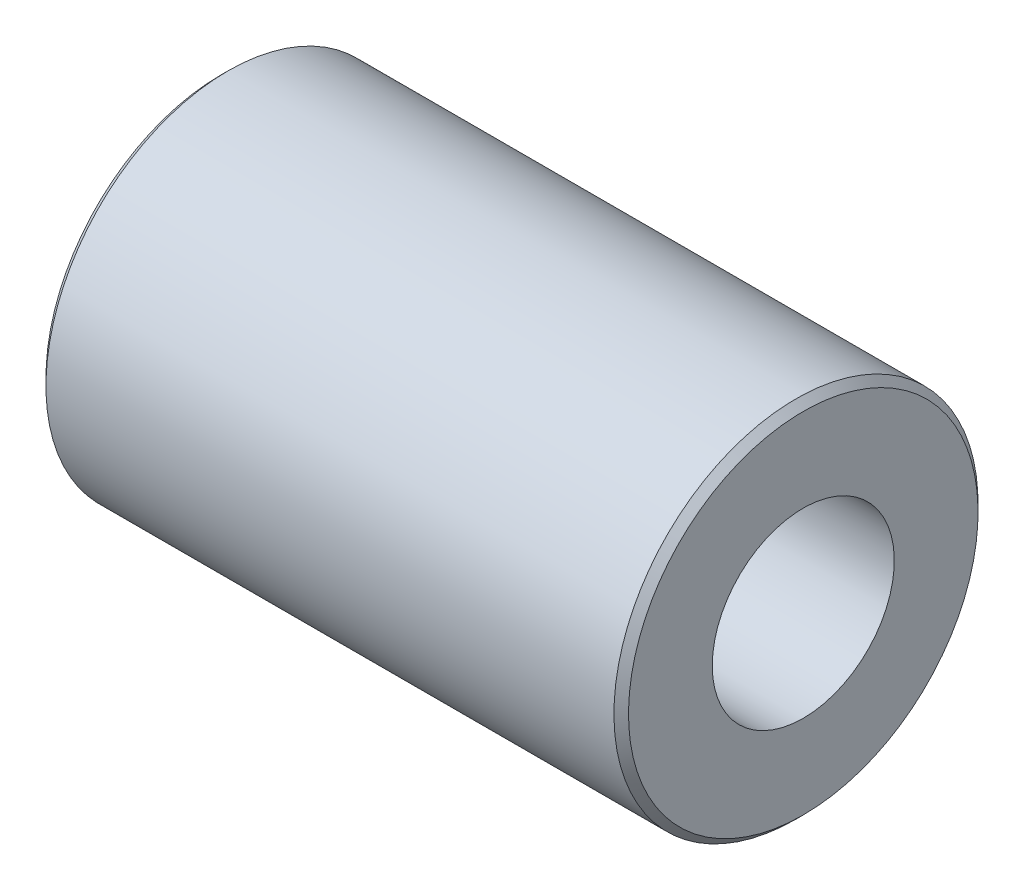
ISO-10303-21;
HEADER;
FILE_DESCRIPTION(('STEP AP214'),'2;1');
FILE_NAME('part.step','',(''),(''),'','','');
FILE_SCHEMA(('AUTOMOTIVE_DESIGN { 1 0 10303 214 1 1 1 1 }'));
ENDSEC;
DATA;
#1=APPLICATION_CONTEXT('core data for automotive mechanical design processes');
#2=APPLICATION_PROTOCOL_DEFINITION('international standard','automotive_design',2000,#1);
#3=PRODUCT_CONTEXT('',#1,'mechanical');
#4=PRODUCT('Part','Part','',(#3));
#5=PRODUCT_RELATED_PRODUCT_CATEGORY('part','',(#4));
#6=PRODUCT_DEFINITION_FORMATION('','',#4);
#7=PRODUCT_DEFINITION_CONTEXT('part definition',#1,'design');
#8=PRODUCT_DEFINITION('design','',#6,#7);
#9=PRODUCT_DEFINITION_SHAPE('','',#8);
#10=(LENGTH_UNIT() NAMED_UNIT(*) SI_UNIT(.MILLI.,.METRE.));
#11=(NAMED_UNIT(*) PLANE_ANGLE_UNIT() SI_UNIT($,.RADIAN.));
#12=(NAMED_UNIT(*) SI_UNIT($,.STERADIAN.) SOLID_ANGLE_UNIT());
#13=UNCERTAINTY_MEASURE_WITH_UNIT(LENGTH_MEASURE(1.E-05),#10,'distance_accuracy_value','');
#14=(GEOMETRIC_REPRESENTATION_CONTEXT(3) GLOBAL_UNCERTAINTY_ASSIGNED_CONTEXT((#13)) GLOBAL_UNIT_ASSIGNED_CONTEXT((#10,
#11,#12)) REPRESENTATION_CONTEXT('',''));
#15=CARTESIAN_POINT('',(0.,0.,0.));
#16=DIRECTION('',(0.,0.,1.));
#17=DIRECTION('',(1.,0.,0.));
#18=AXIS2_PLACEMENT_3D('',#15,#16,#17);
#19=CARTESIAN_POINT('',(4.,0.,0.));
#20=DIRECTION('',(-1.,0.,0.));
#21=DIRECTION('',(0.,-1.,0.));
#22=AXIS2_PLACEMENT_3D('',#19,#20,#21);
#23=PLANE('',#22);
#24=CARTESIAN_POINT('',(4.,0.,0.));
#25=DIRECTION('',(-1.,0.,0.));
#26=DIRECTION('',(0.,-1.,0.));
#27=AXIS2_PLACEMENT_3D('',#24,#25,#26);
#28=CIRCLE('',#27,2.4);
#29=CARTESIAN_POINT('',(4.,-2.4,0.));
#30=VERTEX_POINT('',#29);
#31=EDGE_CURVE('E48',#30,#30,#28,.F.);
#32=ORIENTED_EDGE('',*,*,#31,.T.);
#33=EDGE_LOOP('',(#32));
#34=FACE_BOUND('',#33,.T.);
#35=CARTESIAN_POINT('',(4.,0.,0.));
#36=DIRECTION('',(-1.,0.,0.));
#37=DIRECTION('',(0.,-1.,0.));
#38=AXIS2_PLACEMENT_3D('',#35,#36,#37);
#39=CIRCLE('',#38,1.25);
#40=CARTESIAN_POINT('',(4.,-1.25,0.));
#41=VERTEX_POINT('',#40);
#42=EDGE_CURVE('E61',#41,#41,#39,.T.);
#43=ORIENTED_EDGE('',*,*,#42,.T.);
#44=EDGE_LOOP('',(#43));
#45=FACE_BOUND('',#44,.T.);
#46=ADVANCED_FACE('F40',(#34,#45),#23,.F.);
#47=CARTESIAN_POINT('',(-4.,0.,0.));
#48=DIRECTION('',(-1.,0.,0.));
#49=DIRECTION('',(0.,-1.,0.));
#50=AXIS2_PLACEMENT_3D('',#47,#48,#49);
#51=CYLINDRICAL_SURFACE('',#50,2.5);
#52=CARTESIAN_POINT('',(3.9,0.,0.));
#53=DIRECTION('',(-1.,0.,0.));
#54=DIRECTION('',(0.,-1.,0.));
#55=AXIS2_PLACEMENT_3D('',#52,#53,#54);
#56=CIRCLE('',#55,2.5);
#57=CARTESIAN_POINT('',(3.9,-2.50000000000001,0.));
#58=VERTEX_POINT('',#57);
#59=EDGE_CURVE('E52',#58,#58,#56,.T.);
#60=ORIENTED_EDGE('',*,*,#59,.T.);
#61=EDGE_LOOP('',(#60));
#62=FACE_BOUND('',#61,.T.);
#63=CARTESIAN_POINT('',(-3.89999999999999,0.,0.));
#64=DIRECTION('',(1.,0.,0.));
#65=DIRECTION('',(0.,1.,0.));
#66=AXIS2_PLACEMENT_3D('',#63,#64,#65);
#67=CIRCLE('',#66,2.5);
#68=CARTESIAN_POINT('',(-3.89999999999999,2.5,0.));
#69=VERTEX_POINT('',#68);
#70=EDGE_CURVE('E56',#69,#69,#67,.T.);
#71=ORIENTED_EDGE('',*,*,#70,.T.);
#72=EDGE_LOOP('',(#71));
#73=FACE_BOUND('',#72,.T.);
#74=ADVANCED_FACE('F73',(#62,#73),#51,.T.);
#75=CARTESIAN_POINT('',(-4.,2.5,0.));
#76=DIRECTION('',(1.,0.,0.));
#77=DIRECTION('',(0.,1.,0.));
#78=AXIS2_PLACEMENT_3D('',#75,#76,#77);
#79=PLANE('',#78);
#80=CARTESIAN_POINT('',(-4.,0.,0.));
#81=DIRECTION('',(1.,0.,0.));
#82=DIRECTION('',(0.,1.,0.));
#83=AXIS2_PLACEMENT_3D('',#80,#81,#82);
#84=CIRCLE('',#83,2.4);
#85=CARTESIAN_POINT('',(-4.,2.39999999999999,0.));
#86=VERTEX_POINT('',#85);
#87=EDGE_CURVE('E10',#86,#86,#84,.F.);
#88=ORIENTED_EDGE('',*,*,#87,.T.);
#89=EDGE_LOOP('',(#88));
#90=FACE_BOUND('',#89,.T.);
#91=CARTESIAN_POINT('',(-4.,0.,0.));
#92=DIRECTION('',(-1.,0.,0.));
#93=DIRECTION('',(0.,0.,1.));
#94=AXIS2_PLACEMENT_3D('',#91,#92,#93);
#95=CIRCLE('',#94,1.25);
#96=CARTESIAN_POINT('',(-4.,0.,1.25));
#97=VERTEX_POINT('',#96);
#98=EDGE_CURVE('E64',#97,#97,#95,.T.);
#99=ORIENTED_EDGE('',*,*,#98,.F.);
#100=EDGE_LOOP('',(#99));
#101=FACE_BOUND('',#100,.T.);
#102=ADVANCED_FACE('F71',(#90,#101),#79,.F.);
#103=CARTESIAN_POINT('',(-4.,0.,0.));
#104=DIRECTION('',(-1.,0.,0.));
#105=DIRECTION('',(0.,0.,1.));
#106=AXIS2_PLACEMENT_3D('',#103,#104,#105);
#107=CYLINDRICAL_SURFACE('',#106,1.25);
#108=ORIENTED_EDGE('',*,*,#98,.T.);
#109=EDGE_LOOP('',(#108));
#110=FACE_BOUND('',#109,.T.);
#111=ORIENTED_EDGE('',*,*,#42,.F.);
#112=EDGE_LOOP('',(#111));
#113=FACE_BOUND('',#112,.T.);
#114=ADVANCED_FACE('F68',(#110,#113),#107,.F.);
#115=CARTESIAN_POINT('',(3.9,0.,0.));
#116=DIRECTION('',(-1.,0.,0.));
#117=DIRECTION('',(0.,-1.,0.));
#118=AXIS2_PLACEMENT_3D('',#115,#116,#117);
#119=CONICAL_SURFACE('',#118,2.5,0.785398163397446);
#120=ORIENTED_EDGE('',*,*,#31,.F.);
#121=EDGE_LOOP('',(#120));
#122=FACE_BOUND('',#121,.T.);
#123=ORIENTED_EDGE('',*,*,#59,.F.);
#124=EDGE_LOOP('',(#123));
#125=FACE_BOUND('',#124,.T.);
#126=ADVANCED_FACE('F79',(#122,#125),#119,.T.);
#127=CARTESIAN_POINT('',(-4.,0.,0.));
#128=DIRECTION('',(1.,0.,0.));
#129=DIRECTION('',(0.,1.,0.));
#130=AXIS2_PLACEMENT_3D('',#127,#128,#129);
#131=CONICAL_SURFACE('',#130,2.4,0.785398163397435);
#132=ORIENTED_EDGE('',*,*,#70,.F.);
#133=EDGE_LOOP('',(#132));
#134=FACE_BOUND('',#133,.T.);
#135=ORIENTED_EDGE('',*,*,#87,.F.);
#136=EDGE_LOOP('',(#135));
#137=FACE_BOUND('',#136,.T.);
#138=ADVANCED_FACE('F43',(#134,#137),#131,.T.);
#139=CLOSED_SHELL('',(#46,#74,#102,#114,#126,#138));
#140=MANIFOLD_SOLID_BREP('B2',#139);
#141=ADVANCED_BREP_SHAPE_REPRESENTATION('',(#18,#140),#14);
#142=SHAPE_DEFINITION_REPRESENTATION(#9,#141);
ENDSEC;
END-ISO-10303-21;
